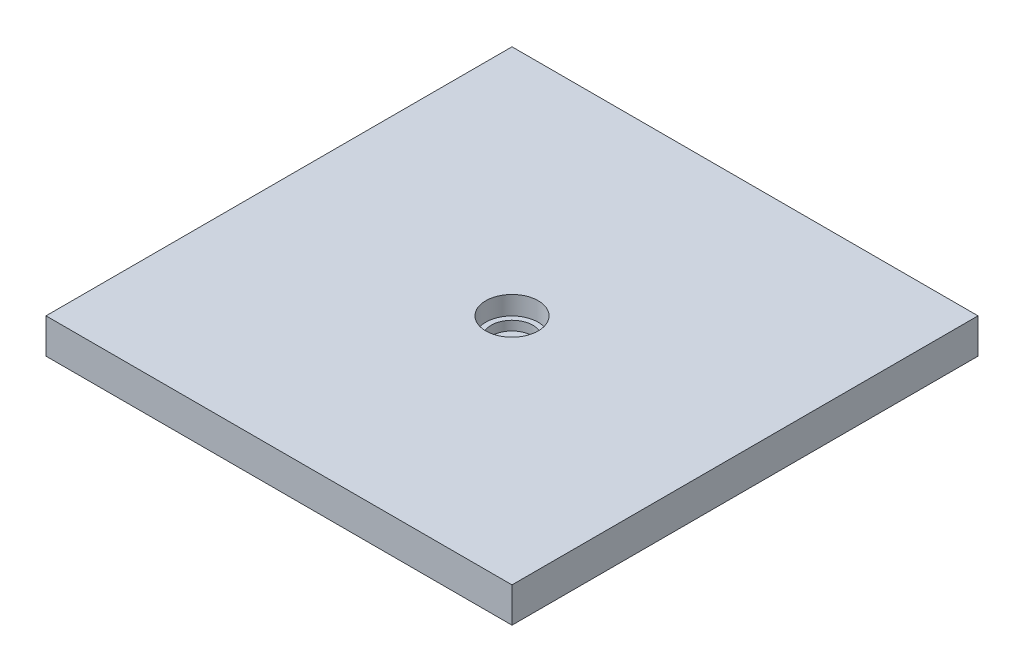
ISO-10303-21;
HEADER;
FILE_DESCRIPTION(('STEP AP214'),'2;1');
FILE_NAME('part.step','',(''),(''),'','','');
FILE_SCHEMA(('AUTOMOTIVE_DESIGN { 1 0 10303 214 1 1 1 1 }'));
ENDSEC;
DATA;
#1=APPLICATION_CONTEXT('core data for automotive mechanical design processes');
#2=APPLICATION_PROTOCOL_DEFINITION('international standard','automotive_design',2000,#1);
#3=PRODUCT_CONTEXT('',#1,'mechanical');
#4=PRODUCT('Part','Part','',(#3));
#5=PRODUCT_RELATED_PRODUCT_CATEGORY('part','',(#4));
#6=PRODUCT_DEFINITION_FORMATION('','',#4);
#7=PRODUCT_DEFINITION_CONTEXT('part definition',#1,'design');
#8=PRODUCT_DEFINITION('design','',#6,#7);
#9=PRODUCT_DEFINITION_SHAPE('','',#8);
#10=(LENGTH_UNIT() NAMED_UNIT(*) SI_UNIT(.MILLI.,.METRE.));
#11=(NAMED_UNIT(*) PLANE_ANGLE_UNIT() SI_UNIT($,.RADIAN.));
#12=(NAMED_UNIT(*) SI_UNIT($,.STERADIAN.) SOLID_ANGLE_UNIT());
#13=UNCERTAINTY_MEASURE_WITH_UNIT(LENGTH_MEASURE(1.E-05),#10,'distance_accuracy_value','');
#14=(GEOMETRIC_REPRESENTATION_CONTEXT(3) GLOBAL_UNCERTAINTY_ASSIGNED_CONTEXT((#13)) GLOBAL_UNIT_ASSIGNED_CONTEXT((#10,
#11,#12)) REPRESENTATION_CONTEXT('',''));
#15=CARTESIAN_POINT('',(0.,0.,0.));
#16=DIRECTION('',(0.,0.,1.));
#17=DIRECTION('',(1.,0.,0.));
#18=AXIS2_PLACEMENT_3D('',#15,#16,#17);
#19=CARTESIAN_POINT('',(-100.,15.,-100.));
#20=DIRECTION('',(1.,0.,0.));
#21=DIRECTION('',(0.,0.,-1.));
#22=AXIS2_PLACEMENT_3D('',#19,#20,#21);
#23=PLANE('',#22);
#24=DIRECTION('',(0.,0.,1.));
#25=VECTOR('',#24,1.);
#26=CARTESIAN_POINT('',(-100.,0.,-100.));
#27=LINE('',#26,#25);
#28=CARTESIAN_POINT('',(-100.,0.,-100.));
#29=VERTEX_POINT('',#28);
#30=CARTESIAN_POINT('',(-100.,0.,100.));
#31=VERTEX_POINT('',#30);
#32=EDGE_CURVE('E113',#29,#31,#27,.T.);
#33=ORIENTED_EDGE('',*,*,#32,.T.);
#34=DIRECTION('',(0.,-1.,0.));
#35=VECTOR('',#34,1.);
#36=CARTESIAN_POINT('',(-100.,15.,100.));
#37=LINE('',#36,#35);
#38=CARTESIAN_POINT('',(-100.,15.,100.));
#39=VERTEX_POINT('',#38);
#40=EDGE_CURVE('E11',#39,#31,#37,.T.);
#41=ORIENTED_EDGE('',*,*,#40,.F.);
#42=DIRECTION('',(0.,0.,1.));
#43=VECTOR('',#42,1.);
#44=CARTESIAN_POINT('',(-100.,15.,-100.));
#45=LINE('',#44,#43);
#46=CARTESIAN_POINT('',(-100.,15.,-100.));
#47=VERTEX_POINT('',#46);
#48=EDGE_CURVE('E97',#47,#39,#45,.T.);
#49=ORIENTED_EDGE('',*,*,#48,.F.);
#50=DIRECTION('',(0.,-1.,0.));
#51=VECTOR('',#50,1.);
#52=CARTESIAN_POINT('',(-100.,15.,-100.));
#53=LINE('',#52,#51);
#54=EDGE_CURVE('E109',#47,#29,#53,.T.);
#55=ORIENTED_EDGE('',*,*,#54,.T.);
#56=EDGE_LOOP('',(#33,#41,#49,#55));
#57=FACE_BOUND('',#56,.T.);
#58=ADVANCED_FACE('F45',(#57),#23,.F.);
#59=CARTESIAN_POINT('',(-100.,15.,100.));
#60=DIRECTION('',(0.,0.,-1.));
#61=DIRECTION('',(-1.,0.,0.));
#62=AXIS2_PLACEMENT_3D('',#59,#60,#61);
#63=PLANE('',#62);
#64=DIRECTION('',(1.,0.,0.));
#65=VECTOR('',#64,1.);
#66=CARTESIAN_POINT('',(-100.,0.,100.));
#67=LINE('',#66,#65);
#68=CARTESIAN_POINT('',(100.,0.,100.));
#69=VERTEX_POINT('',#68);
#70=EDGE_CURVE('E102',#31,#69,#67,.T.);
#71=ORIENTED_EDGE('',*,*,#70,.T.);
#72=DIRECTION('',(0.,-1.,0.));
#73=VECTOR('',#72,1.);
#74=CARTESIAN_POINT('',(100.,15.,100.));
#75=LINE('',#74,#73);
#76=CARTESIAN_POINT('',(100.,15.,100.));
#77=VERTEX_POINT('',#76);
#78=EDGE_CURVE('E54',#77,#69,#75,.T.);
#79=ORIENTED_EDGE('',*,*,#78,.F.);
#80=DIRECTION('',(1.,0.,0.));
#81=VECTOR('',#80,1.);
#82=CARTESIAN_POINT('',(-100.,15.,100.));
#83=LINE('',#82,#81);
#84=EDGE_CURVE('E92',#39,#77,#83,.T.);
#85=ORIENTED_EDGE('',*,*,#84,.F.);
#86=ORIENTED_EDGE('',*,*,#40,.T.);
#87=EDGE_LOOP('',(#71,#79,#85,#86));
#88=FACE_BOUND('',#87,.T.);
#89=ADVANCED_FACE('F101',(#88),#63,.F.);
#90=CARTESIAN_POINT('',(100.,15.,-100.));
#91=DIRECTION('',(-1.,0.,0.));
#92=DIRECTION('',(0.,0.,1.));
#93=AXIS2_PLACEMENT_3D('',#90,#91,#92);
#94=PLANE('',#93);
#95=DIRECTION('',(0.,0.,-1.));
#96=VECTOR('',#95,1.);
#97=CARTESIAN_POINT('',(100.,0.,-100.));
#98=LINE('',#97,#96);
#99=CARTESIAN_POINT('',(100.,0.,-100.));
#100=VERTEX_POINT('',#99);
#101=EDGE_CURVE('E79',#69,#100,#98,.T.);
#102=ORIENTED_EDGE('',*,*,#101,.T.);
#103=DIRECTION('',(0.,-1.,0.));
#104=VECTOR('',#103,1.);
#105=CARTESIAN_POINT('',(100.,15.,-100.));
#106=LINE('',#105,#104);
#107=CARTESIAN_POINT('',(100.,15.,-100.));
#108=VERTEX_POINT('',#107);
#109=EDGE_CURVE('E104',#108,#100,#106,.T.);
#110=ORIENTED_EDGE('',*,*,#109,.F.);
#111=DIRECTION('',(0.,0.,-1.));
#112=VECTOR('',#111,1.);
#113=CARTESIAN_POINT('',(100.,15.,-100.));
#114=LINE('',#113,#112);
#115=EDGE_CURVE('E95',#77,#108,#114,.T.);
#116=ORIENTED_EDGE('',*,*,#115,.F.);
#117=ORIENTED_EDGE('',*,*,#78,.T.);
#118=EDGE_LOOP('',(#102,#110,#116,#117));
#119=FACE_BOUND('',#118,.T.);
#120=ADVANCED_FACE('F105',(#119),#94,.F.);
#121=CARTESIAN_POINT('',(-100.,15.,-100.));
#122=DIRECTION('',(0.,0.,1.));
#123=DIRECTION('',(1.,0.,0.));
#124=AXIS2_PLACEMENT_3D('',#121,#122,#123);
#125=PLANE('',#124);
#126=DIRECTION('',(-1.,0.,0.));
#127=VECTOR('',#126,1.);
#128=CARTESIAN_POINT('',(-100.,0.,-100.));
#129=LINE('',#128,#127);
#130=EDGE_CURVE('E85',#100,#29,#129,.T.);
#131=ORIENTED_EDGE('',*,*,#130,.T.);
#132=ORIENTED_EDGE('',*,*,#54,.F.);
#133=DIRECTION('',(-1.,0.,0.));
#134=VECTOR('',#133,1.);
#135=CARTESIAN_POINT('',(-100.,15.,-100.));
#136=LINE('',#135,#134);
#137=EDGE_CURVE('E62',#108,#47,#136,.T.);
#138=ORIENTED_EDGE('',*,*,#137,.F.);
#139=ORIENTED_EDGE('',*,*,#109,.T.);
#140=EDGE_LOOP('',(#131,#132,#138,#139));
#141=FACE_BOUND('',#140,.T.);
#142=ADVANCED_FACE('F127',(#141),#125,.F.);
#143=CARTESIAN_POINT('',(0.,15.,0.));
#144=DIRECTION('',(0.,1.,0.));
#145=DIRECTION('',(0.,0.,1.));
#146=AXIS2_PLACEMENT_3D('',#143,#144,#145);
#147=PLANE('',#146);
#148=CARTESIAN_POINT('',(0.,15.,0.));
#149=DIRECTION('',(0.,1.,0.));
#150=DIRECTION('',(0.,0.,1.));
#151=AXIS2_PLACEMENT_3D('',#148,#149,#150);
#152=CIRCLE('',#151,11.25);
#153=CARTESIAN_POINT('',(0.,15.,11.25));
#154=VERTEX_POINT('',#153);
#155=EDGE_CURVE('E134',#154,#154,#152,.T.);
#156=ORIENTED_EDGE('',*,*,#155,.F.);
#157=EDGE_LOOP('',(#156));
#158=FACE_BOUND('',#157,.T.);
#159=ORIENTED_EDGE('',*,*,#48,.T.);
#160=ORIENTED_EDGE('',*,*,#84,.T.);
#161=ORIENTED_EDGE('',*,*,#115,.T.);
#162=ORIENTED_EDGE('',*,*,#137,.T.);
#163=EDGE_LOOP('',(#159,#160,#161,#162));
#164=FACE_BOUND('',#163,.T.);
#165=ADVANCED_FACE('F93',(#158,#164),#147,.T.);
#166=CARTESIAN_POINT('',(0.,0.,0.));
#167=DIRECTION('',(0.,1.,0.));
#168=DIRECTION('',(0.,0.,1.));
#169=AXIS2_PLACEMENT_3D('',#166,#167,#168);
#170=PLANE('',#169);
#171=ORIENTED_EDGE('',*,*,#32,.F.);
#172=ORIENTED_EDGE('',*,*,#130,.F.);
#173=ORIENTED_EDGE('',*,*,#101,.F.);
#174=ORIENTED_EDGE('',*,*,#70,.F.);
#175=EDGE_LOOP('',(#171,#172,#173,#174));
#176=FACE_BOUND('',#175,.T.);
#177=ADVANCED_FACE('F130',(#176),#170,.F.);
#178=CARTESIAN_POINT('',(0.,7.,0.));
#179=DIRECTION('',(0.,1.,0.));
#180=DIRECTION('',(0.,0.,1.));
#181=AXIS2_PLACEMENT_3D('',#178,#179,#180);
#182=CYLINDRICAL_SURFACE('',#181,11.25);
#183=CARTESIAN_POINT('',(0.,7.,0.));
#184=DIRECTION('',(0.,1.,0.));
#185=DIRECTION('',(0.,0.,1.));
#186=AXIS2_PLACEMENT_3D('',#183,#184,#185);
#187=CIRCLE('',#186,11.25);
#188=CARTESIAN_POINT('',(0.,7.,11.25));
#189=VERTEX_POINT('',#188);
#190=EDGE_CURVE('E117',#189,#189,#187,.T.);
#191=ORIENTED_EDGE('',*,*,#190,.F.);
#192=EDGE_LOOP('',(#191));
#193=FACE_BOUND('',#192,.T.);
#194=ORIENTED_EDGE('',*,*,#155,.T.);
#195=EDGE_LOOP('',(#194));
#196=FACE_BOUND('',#195,.T.);
#197=ADVANCED_FACE('F161',(#193,#196),#182,.F.);
#198=CARTESIAN_POINT('',(0.,7.,0.));
#199=DIRECTION('',(0.,1.,0.));
#200=DIRECTION('',(0.,0.,1.));
#201=AXIS2_PLACEMENT_3D('',#198,#199,#200);
#202=PLANE('',#201);
#203=CARTESIAN_POINT('',(0.,7.,0.));
#204=DIRECTION('',(0.,1.,0.));
#205=DIRECTION('',(0.,0.,1.));
#206=AXIS2_PLACEMENT_3D('',#203,#204,#205);
#207=CIRCLE('',#206,9.);
#208=CARTESIAN_POINT('',(0.,7.,9.));
#209=VERTEX_POINT('',#208);
#210=EDGE_CURVE('E142',#209,#209,#207,.T.);
#211=ORIENTED_EDGE('',*,*,#210,.F.);
#212=EDGE_LOOP('',(#211));
#213=FACE_BOUND('',#212,.T.);
#214=ORIENTED_EDGE('',*,*,#190,.T.);
#215=EDGE_LOOP('',(#214));
#216=FACE_BOUND('',#215,.T.);
#217=ADVANCED_FACE('F155',(#213,#216),#202,.T.);
#218=CARTESIAN_POINT('',(0.,3.,0.));
#219=DIRECTION('',(0.,1.,0.));
#220=DIRECTION('',(0.,0.,1.));
#221=AXIS2_PLACEMENT_3D('',#218,#219,#220);
#222=CYLINDRICAL_SURFACE('',#221,9.);
#223=CARTESIAN_POINT('',(0.,3.,0.));
#224=DIRECTION('',(0.,1.,0.));
#225=DIRECTION('',(0.,0.,1.));
#226=AXIS2_PLACEMENT_3D('',#223,#224,#225);
#227=CIRCLE('',#226,9.);
#228=CARTESIAN_POINT('',(0.,3.,9.));
#229=VERTEX_POINT('',#228);
#230=EDGE_CURVE('E138',#229,#229,#227,.T.);
#231=ORIENTED_EDGE('',*,*,#230,.F.);
#232=EDGE_LOOP('',(#231));
#233=FACE_BOUND('',#232,.T.);
#234=ORIENTED_EDGE('',*,*,#210,.T.);
#235=EDGE_LOOP('',(#234));
#236=FACE_BOUND('',#235,.T.);
#237=ADVANCED_FACE('F152',(#233,#236),#222,.F.);
#238=CARTESIAN_POINT('',(0.,3.,0.));
#239=DIRECTION('',(0.,1.,0.));
#240=DIRECTION('',(0.,0.,1.));
#241=AXIS2_PLACEMENT_3D('',#238,#239,#240);
#242=PLANE('',#241);
#243=ORIENTED_EDGE('',*,*,#230,.T.);
#244=EDGE_LOOP('',(#243));
#245=FACE_BOUND('',#244,.T.);
#246=ADVANCED_FACE('F150',(#245),#242,.T.);
#247=CLOSED_SHELL('',(#58,#89,#120,#142,#165,#177,#197,#217,#237,#246));
#248=MANIFOLD_SOLID_BREP('B2',#247);
#249=ADVANCED_BREP_SHAPE_REPRESENTATION('',(#18,#248),#14);
#250=SHAPE_DEFINITION_REPRESENTATION(#9,#249);
ENDSEC;
END-ISO-10303-21;
